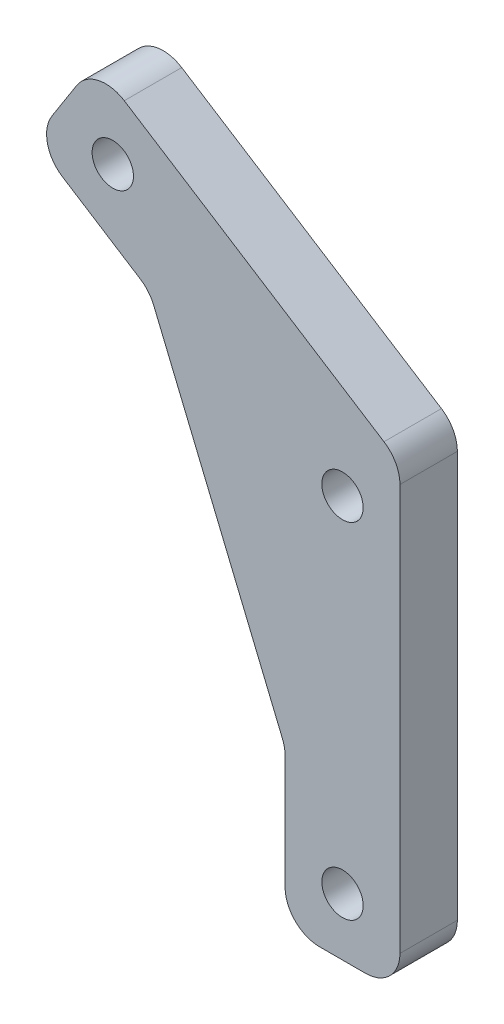
ISO-10303-21;
HEADER;
FILE_DESCRIPTION(('STEP AP214'),'2;1');
FILE_NAME('part.step','',(''),(''),'','','');
FILE_SCHEMA(('AUTOMOTIVE_DESIGN { 1 0 10303 214 1 1 1 1 }'));
ENDSEC;
DATA;
#1=APPLICATION_CONTEXT('core data for automotive mechanical design processes');
#2=APPLICATION_PROTOCOL_DEFINITION('international standard','automotive_design',2000,#1);
#3=PRODUCT_CONTEXT('',#1,'mechanical');
#4=PRODUCT('Part','Part','',(#3));
#5=PRODUCT_RELATED_PRODUCT_CATEGORY('part','',(#4));
#6=PRODUCT_DEFINITION_FORMATION('','',#4);
#7=PRODUCT_DEFINITION_CONTEXT('part definition',#1,'design');
#8=PRODUCT_DEFINITION('design','',#6,#7);
#9=PRODUCT_DEFINITION_SHAPE('','',#8);
#10=(LENGTH_UNIT() NAMED_UNIT(*) SI_UNIT(.MILLI.,.METRE.));
#11=(NAMED_UNIT(*) PLANE_ANGLE_UNIT() SI_UNIT($,.RADIAN.));
#12=(NAMED_UNIT(*) SI_UNIT($,.STERADIAN.) SOLID_ANGLE_UNIT());
#13=UNCERTAINTY_MEASURE_WITH_UNIT(LENGTH_MEASURE(1.E-05),#10,'distance_accuracy_value','');
#14=(GEOMETRIC_REPRESENTATION_CONTEXT(3) GLOBAL_UNCERTAINTY_ASSIGNED_CONTEXT((#13)) GLOBAL_UNIT_ASSIGNED_CONTEXT((#10,
#11,#12)) REPRESENTATION_CONTEXT('',''));
#15=CARTESIAN_POINT('',(0.,0.,0.));
#16=DIRECTION('',(0.,0.,1.));
#17=DIRECTION('',(1.,0.,0.));
#18=AXIS2_PLACEMENT_3D('',#15,#16,#17);
#19=CARTESIAN_POINT('',(0.,0.,6.35));
#20=DIRECTION('',(0.,0.,1.));
#21=DIRECTION('',(1.,0.,0.));
#22=AXIS2_PLACEMENT_3D('',#19,#20,#21);
#23=PLANE('',#22);
#24=CARTESIAN_POINT('',(0.,38.1,6.35));
#25=DIRECTION('',(0.,0.,1.));
#26=DIRECTION('',(1.,0.,0.));
#27=AXIS2_PLACEMENT_3D('',#24,#25,#26);
#28=CIRCLE('',#27,2.286);
#29=CARTESIAN_POINT('',(2.286,38.1,6.35));
#30=VERTEX_POINT('',#29);
#31=EDGE_CURVE('E508',#30,#30,#28,.T.);
#32=ORIENTED_EDGE('',*,*,#31,.F.);
#33=EDGE_LOOP('',(#32));
#34=FACE_BOUND('',#33,.T.);
#35=DIRECTION('',(-0.843362521056756,0.537345008422702,0.));
#36=VECTOR('',#35,1.);
#37=CARTESIAN_POINT('',(6.35,44.45,6.35));
#38=LINE('',#37,#36);
#39=CARTESIAN_POINT('',(4.58728448209049,45.5731070401742,6.35));
#40=VERTEX_POINT('',#39);
#41=CARTESIAN_POINT('',(-24.13,63.8702083301041,6.35));
#42=VERTEX_POINT('',#41);
#43=EDGE_CURVE('E182',#40,#42,#38,.T.);
#44=ORIENTED_EDGE('',*,*,#43,.T.);
#45=CARTESIAN_POINT('',(-26.1772844820905,60.6569971248778,6.35));
#46=DIRECTION('',(0.,0.,1.));
#47=DIRECTION('',(1.,0.,0.));
#48=AXIS2_PLACEMENT_3D('',#45,#46,#47);
#49=CIRCLE('',#48,3.81);
#50=CARTESIAN_POINT('',(-29.3904956873168,62.7042816069683,6.35));
#51=VERTEX_POINT('',#50);
#52=EDGE_CURVE('E217',#42,#51,#49,.T.);
#53=ORIENTED_EDGE('',*,*,#52,.T.);
#54=DIRECTION('',(-0.537345008422701,-0.843362521056756,0.));
#55=VECTOR('',#54,1.);
#56=CARTESIAN_POINT('',(-27.3432112052263,65.9174928121946,6.35));
#57=LINE('',#56,#55);
#58=CARTESIAN_POINT('',(-32.1202083301041,58.42,6.35));
#59=VERTEX_POINT('',#58);
#60=EDGE_CURVE('E165',#51,#59,#57,.T.);
#61=ORIENTED_EDGE('',*,*,#60,.T.);
#62=CARTESIAN_POINT('',(-28.9069971248778,56.3727155179095,6.35));
#63=DIRECTION('',(0.,0.,1.));
#64=DIRECTION('',(1.,0.,0.));
#65=AXIS2_PLACEMENT_3D('',#62,#63,#64);
#66=CIRCLE('',#65,3.81);
#67=CARTESIAN_POINT('',(-30.9542816069683,53.1595043126833,6.35));
#68=VERTEX_POINT('',#67);
#69=EDGE_CURVE('E210',#59,#68,#66,.T.);
#70=ORIENTED_EDGE('',*,*,#69,.T.);
#71=DIRECTION('',(0.843362521056756,-0.537345008422701,0.));
#72=VECTOR('',#71,1.);
#73=CARTESIAN_POINT('',(-34.1674928121946,55.2067887947738,6.35));
#74=LINE('',#73,#72);
#75=CARTESIAN_POINT('',(-22.3581072258093,47.6824866839427,6.35));
#76=VERTEX_POINT('',#75);
#77=EDGE_CURVE('E252',#68,#76,#74,.T.);
#78=ORIENTED_EDGE('',*,*,#77,.T.);
#79=CARTESIAN_POINT('',(-24.4053917078998,44.4692754787165,6.35));
#80=DIRECTION('',(0.,0.,1.));
#81=DIRECTION('',(1.,0.,0.));
#82=AXIS2_PLACEMENT_3D('',#79,#80,#81);
#83=CIRCLE('',#82,3.81);
#84=CARTESIAN_POINT('',(-20.8853322068173,45.9271098687756,6.35));
#85=VERTEX_POINT('',#84);
#86=EDGE_CURVE('E51',#76,#85,#83,.F.);
#87=ORIENTED_EDGE('',*,*,#86,.T.);
#88=DIRECTION('',(-0.382633698178239,0.923900131517711,0.));
#89=VECTOR('',#88,1.);
#90=CARTESIAN_POINT('',(-6.35,10.8303700848256,6.35));
#91=LINE('',#90,#89);
#92=CARTESIAN_POINT('',(-6.63994049891752,11.5304549606679,6.35));
#93=VERTEX_POINT('',#92);
#94=EDGE_CURVE('E197',#85,#93,#91,.F.);
#95=ORIENTED_EDGE('',*,*,#94,.T.);
#96=CARTESIAN_POINT('',(-10.16,10.0726205706088,6.35));
#97=DIRECTION('',(0.,0.,1.));
#98=DIRECTION('',(1.,0.,0.));
#99=AXIS2_PLACEMENT_3D('',#96,#97,#98);
#100=CIRCLE('',#99,3.81);
#101=CARTESIAN_POINT('',(-6.35,10.0726205706088,6.35));
#102=VERTEX_POINT('',#101);
#103=EDGE_CURVE('E245',#93,#102,#100,.F.);
#104=ORIENTED_EDGE('',*,*,#103,.T.);
#105=DIRECTION('',(0.,-1.,0.));
#106=VECTOR('',#105,1.);
#107=CARTESIAN_POINT('',(-6.35,37.4829861164933,6.35));
#108=LINE('',#107,#106);
#109=CARTESIAN_POINT('',(-6.35,-2.54,6.35));
#110=VERTEX_POINT('',#109);
#111=EDGE_CURVE('E268',#102,#110,#108,.T.);
#112=ORIENTED_EDGE('',*,*,#111,.T.);
#113=CARTESIAN_POINT('',(-2.54,-2.54,6.35));
#114=DIRECTION('',(0.,0.,1.));
#115=DIRECTION('',(1.,0.,0.));
#116=AXIS2_PLACEMENT_3D('',#113,#114,#115);
#117=CIRCLE('',#116,3.81);
#118=CARTESIAN_POINT('',(-2.54,-6.35,6.35));
#119=VERTEX_POINT('',#118);
#120=EDGE_CURVE('E212',#110,#119,#117,.T.);
#121=ORIENTED_EDGE('',*,*,#120,.T.);
#122=DIRECTION('',(1.,0.,0.));
#123=VECTOR('',#122,1.);
#124=CARTESIAN_POINT('',(-6.35,-6.35,6.35));
#125=LINE('',#124,#123);
#126=CARTESIAN_POINT('',(2.54,-6.35,6.35));
#127=VERTEX_POINT('',#126);
#128=EDGE_CURVE('E274',#119,#127,#125,.T.);
#129=ORIENTED_EDGE('',*,*,#128,.T.);
#130=CARTESIAN_POINT('',(2.54,-2.54,6.35));
#131=DIRECTION('',(0.,0.,1.));
#132=DIRECTION('',(1.,0.,0.));
#133=AXIS2_PLACEMENT_3D('',#130,#131,#132);
#134=CIRCLE('',#133,3.81);
#135=CARTESIAN_POINT('',(6.35,-2.54,6.35));
#136=VERTEX_POINT('',#135);
#137=EDGE_CURVE('E65',#127,#136,#134,.T.);
#138=ORIENTED_EDGE('',*,*,#137,.T.);
#139=DIRECTION('',(0.,1.,0.));
#140=VECTOR('',#139,1.);
#141=CARTESIAN_POINT('',(6.35,-6.35,6.35));
#142=LINE('',#141,#140);
#143=CARTESIAN_POINT('',(6.35,42.359895834948,6.35));
#144=VERTEX_POINT('',#143);
#145=EDGE_CURVE('E275',#136,#144,#142,.T.);
#146=ORIENTED_EDGE('',*,*,#145,.T.);
#147=CARTESIAN_POINT('',(2.54,42.359895834948,6.35));
#148=DIRECTION('',(0.,0.,1.));
#149=DIRECTION('',(1.,0.,0.));
#150=AXIS2_PLACEMENT_3D('',#147,#148,#149);
#151=CIRCLE('',#150,3.81);
#152=EDGE_CURVE('E215',#144,#40,#151,.T.);
#153=ORIENTED_EDGE('',*,*,#152,.T.);
#154=EDGE_LOOP('',(#44,#53,#61,#70,#78,#87,#95,#104,#112,#121,#129,#138,#146,#153));
#155=FACE_BOUND('',#154,.T.);
#156=CARTESIAN_POINT('',(0.,0.,6.35));
#157=DIRECTION('',(0.,0.,1.));
#158=DIRECTION('',(1.,0.,0.));
#159=AXIS2_PLACEMENT_3D('',#156,#157,#158);
#160=CIRCLE('',#159,2.286);
#161=CARTESIAN_POINT('',(2.286,0.,6.35));
#162=VERTEX_POINT('',#161);
#163=EDGE_CURVE('E173',#162,#162,#160,.T.);
#164=ORIENTED_EDGE('',*,*,#163,.F.);
#165=EDGE_LOOP('',(#164));
#166=FACE_BOUND('',#165,.T.);
#167=CARTESIAN_POINT('',(-25.4,57.15,6.35));
#168=DIRECTION('',(0.,0.,1.));
#169=DIRECTION('',(1.,0.,0.));
#170=AXIS2_PLACEMENT_3D('',#167,#168,#169);
#171=CIRCLE('',#170,2.286);
#172=CARTESIAN_POINT('',(-23.114,57.15,6.35));
#173=VERTEX_POINT('',#172);
#174=EDGE_CURVE('E513',#173,#173,#171,.T.);
#175=ORIENTED_EDGE('',*,*,#174,.F.);
#176=EDGE_LOOP('',(#175));
#177=FACE_BOUND('',#176,.T.);
#178=ADVANCED_FACE('F43',(#34,#155,#166,#177),#23,.T.);
#179=CARTESIAN_POINT('',(0.,0.,0.));
#180=DIRECTION('',(0.,0.,1.));
#181=DIRECTION('',(1.,0.,0.));
#182=AXIS2_PLACEMENT_3D('',#179,#180,#181);
#183=PLANE('',#182);
#184=DIRECTION('',(-0.537345008422701,-0.843362521056756,0.));
#185=VECTOR('',#184,1.);
#186=CARTESIAN_POINT('',(-27.3432112052263,65.9174928121946,0.));
#187=LINE('',#186,#185);
#188=CARTESIAN_POINT('',(-29.3904956873168,62.7042816069683,0.));
#189=VERTEX_POINT('',#188);
#190=CARTESIAN_POINT('',(-32.1202083301041,58.42,0.));
#191=VERTEX_POINT('',#190);
#192=EDGE_CURVE('E162',#189,#191,#187,.T.);
#193=ORIENTED_EDGE('',*,*,#192,.F.);
#194=CARTESIAN_POINT('',(-26.1772844820905,60.6569971248778,0.));
#195=DIRECTION('',(0.,0.,1.));
#196=DIRECTION('',(1.,0.,0.));
#197=AXIS2_PLACEMENT_3D('',#194,#195,#196);
#198=CIRCLE('',#197,3.81);
#199=CARTESIAN_POINT('',(-24.13,63.8702083301041,0.));
#200=VERTEX_POINT('',#199);
#201=EDGE_CURVE('E145',#189,#200,#198,.F.);
#202=ORIENTED_EDGE('',*,*,#201,.T.);
#203=DIRECTION('',(-0.843362521056756,0.537345008422702,0.));
#204=VECTOR('',#203,1.);
#205=CARTESIAN_POINT('',(6.35,44.45,0.));
#206=LINE('',#205,#204);
#207=CARTESIAN_POINT('',(4.58728448209049,45.5731070401742,0.));
#208=VERTEX_POINT('',#207);
#209=EDGE_CURVE('E192',#208,#200,#206,.T.);
#210=ORIENTED_EDGE('',*,*,#209,.F.);
#211=CARTESIAN_POINT('',(2.54,42.359895834948,0.));
#212=DIRECTION('',(0.,0.,1.));
#213=DIRECTION('',(1.,0.,0.));
#214=AXIS2_PLACEMENT_3D('',#211,#212,#213);
#215=CIRCLE('',#214,3.81);
#216=CARTESIAN_POINT('',(6.35,42.359895834948,0.));
#217=VERTEX_POINT('',#216);
#218=EDGE_CURVE('E156',#208,#217,#215,.F.);
#219=ORIENTED_EDGE('',*,*,#218,.T.);
#220=DIRECTION('',(0.,1.,0.));
#221=VECTOR('',#220,1.);
#222=CARTESIAN_POINT('',(6.35,-6.35,0.));
#223=LINE('',#222,#221);
#224=CARTESIAN_POINT('',(6.35,-2.54,0.));
#225=VERTEX_POINT('',#224);
#226=EDGE_CURVE('E190',#225,#217,#223,.T.);
#227=ORIENTED_EDGE('',*,*,#226,.F.);
#228=CARTESIAN_POINT('',(2.54,-2.54,0.));
#229=DIRECTION('',(0.,0.,1.));
#230=DIRECTION('',(1.,0.,0.));
#231=AXIS2_PLACEMENT_3D('',#228,#229,#230);
#232=CIRCLE('',#231,3.81);
#233=CARTESIAN_POINT('',(2.54,-6.35,0.));
#234=VERTEX_POINT('',#233);
#235=EDGE_CURVE('E204',#225,#234,#232,.F.);
#236=ORIENTED_EDGE('',*,*,#235,.T.);
#237=DIRECTION('',(1.,0.,0.));
#238=VECTOR('',#237,1.);
#239=CARTESIAN_POINT('',(-6.35,-6.35,0.));
#240=LINE('',#239,#238);
#241=CARTESIAN_POINT('',(-2.54,-6.35,0.));
#242=VERTEX_POINT('',#241);
#243=EDGE_CURVE('E187',#242,#234,#240,.T.);
#244=ORIENTED_EDGE('',*,*,#243,.F.);
#245=CARTESIAN_POINT('',(-2.54,-2.54,0.));
#246=DIRECTION('',(0.,0.,1.));
#247=DIRECTION('',(1.,0.,0.));
#248=AXIS2_PLACEMENT_3D('',#245,#246,#247);
#249=CIRCLE('',#248,3.81);
#250=CARTESIAN_POINT('',(-6.35,-2.54,0.));
#251=VERTEX_POINT('',#250);
#252=EDGE_CURVE('E202',#242,#251,#249,.F.);
#253=ORIENTED_EDGE('',*,*,#252,.T.);
#254=DIRECTION('',(0.,-1.,0.));
#255=VECTOR('',#254,1.);
#256=CARTESIAN_POINT('',(-6.35,37.4829861164933,0.));
#257=LINE('',#256,#255);
#258=CARTESIAN_POINT('',(-6.35,10.0726205706088,0.));
#259=VERTEX_POINT('',#258);
#260=EDGE_CURVE('E176',#259,#251,#257,.T.);
#261=ORIENTED_EDGE('',*,*,#260,.F.);
#262=CARTESIAN_POINT('',(-10.16,10.0726205706088,0.));
#263=DIRECTION('',(0.,0.,1.));
#264=DIRECTION('',(1.,0.,0.));
#265=AXIS2_PLACEMENT_3D('',#262,#263,#264);
#266=CIRCLE('',#265,3.81);
#267=CARTESIAN_POINT('',(-6.63994049891752,11.5304549606679,0.));
#268=VERTEX_POINT('',#267);
#269=EDGE_CURVE('E243',#259,#268,#266,.T.);
#270=ORIENTED_EDGE('',*,*,#269,.T.);
#271=DIRECTION('',(0.382633698178239,-0.923900131517711,0.));
#272=VECTOR('',#271,1.);
#273=CARTESIAN_POINT('',(-1.59160393633215,-0.659163560452572,0.));
#274=LINE('',#273,#272);
#275=CARTESIAN_POINT('',(-20.8853322068173,45.9271098687756,0.));
#276=VERTEX_POINT('',#275);
#277=EDGE_CURVE('E194',#268,#276,#274,.F.);
#278=ORIENTED_EDGE('',*,*,#277,.T.);
#279=CARTESIAN_POINT('',(-24.4053917078998,44.4692754787165,0.));
#280=DIRECTION('',(0.,0.,1.));
#281=DIRECTION('',(1.,0.,0.));
#282=AXIS2_PLACEMENT_3D('',#279,#280,#281);
#283=CIRCLE('',#282,3.81);
#284=CARTESIAN_POINT('',(-22.3581072258093,47.6824866839427,0.));
#285=VERTEX_POINT('',#284);
#286=EDGE_CURVE('E11',#276,#285,#283,.T.);
#287=ORIENTED_EDGE('',*,*,#286,.T.);
#288=DIRECTION('',(0.843362521056756,-0.537345008422701,0.));
#289=VECTOR('',#288,1.);
#290=CARTESIAN_POINT('',(-34.1674928121946,55.2067887947738,0.));
#291=LINE('',#290,#289);
#292=CARTESIAN_POINT('',(-30.9542816069683,53.1595043126833,0.));
#293=VERTEX_POINT('',#292);
#294=EDGE_CURVE('E172',#293,#285,#291,.T.);
#295=ORIENTED_EDGE('',*,*,#294,.F.);
#296=CARTESIAN_POINT('',(-28.9069971248778,56.3727155179095,0.));
#297=DIRECTION('',(0.,0.,1.));
#298=DIRECTION('',(1.,0.,0.));
#299=AXIS2_PLACEMENT_3D('',#296,#297,#298);
#300=CIRCLE('',#299,3.81);
#301=EDGE_CURVE('E166',#293,#191,#300,.F.);
#302=ORIENTED_EDGE('',*,*,#301,.T.);
#303=EDGE_LOOP('',(#193,#202,#210,#219,#227,#236,#244,#253,#261,#270,#278,#287,#295,#302));
#304=FACE_BOUND('',#303,.T.);
#305=CARTESIAN_POINT('',(0.,0.,0.));
#306=DIRECTION('',(0.,0.,1.));
#307=DIRECTION('',(1.,0.,0.));
#308=AXIS2_PLACEMENT_3D('',#305,#306,#307);
#309=CIRCLE('',#308,2.286);
#310=CARTESIAN_POINT('',(2.286,0.,0.));
#311=VERTEX_POINT('',#310);
#312=EDGE_CURVE('E179',#311,#311,#309,.T.);
#313=ORIENTED_EDGE('',*,*,#312,.T.);
#314=EDGE_LOOP('',(#313));
#315=FACE_BOUND('',#314,.T.);
#316=CARTESIAN_POINT('',(0.,38.1,0.));
#317=DIRECTION('',(0.,0.,1.));
#318=DIRECTION('',(1.,0.,0.));
#319=AXIS2_PLACEMENT_3D('',#316,#317,#318);
#320=CIRCLE('',#319,2.286);
#321=CARTESIAN_POINT('',(2.286,38.1,0.));
#322=VERTEX_POINT('',#321);
#323=EDGE_CURVE('E510',#322,#322,#320,.T.);
#324=ORIENTED_EDGE('',*,*,#323,.T.);
#325=EDGE_LOOP('',(#324));
#326=FACE_BOUND('',#325,.T.);
#327=CARTESIAN_POINT('',(-25.4,57.15,0.));
#328=DIRECTION('',(0.,0.,1.));
#329=DIRECTION('',(1.,0.,0.));
#330=AXIS2_PLACEMENT_3D('',#327,#328,#329);
#331=CIRCLE('',#330,2.286);
#332=CARTESIAN_POINT('',(-23.114,57.15,0.));
#333=VERTEX_POINT('',#332);
#334=EDGE_CURVE('E516',#333,#333,#331,.T.);
#335=ORIENTED_EDGE('',*,*,#334,.T.);
#336=EDGE_LOOP('',(#335));
#337=FACE_BOUND('',#336,.T.);
#338=ADVANCED_FACE('F169',(#304,#315,#326,#337),#183,.F.);
#339=CARTESIAN_POINT('',(-27.3432112052263,65.9174928121946,6.35));
#340=DIRECTION('',(0.843362521056756,-0.537345008422701,0.));
#341=DIRECTION('',(0.537345008422701,0.843362521056756,0.));
#342=AXIS2_PLACEMENT_3D('',#339,#340,#341);
#343=PLANE('',#342);
#344=ORIENTED_EDGE('',*,*,#60,.F.);
#345=DIRECTION('',(0.,0.,-1.));
#346=VECTOR('',#345,1.);
#347=CARTESIAN_POINT('',(-29.3904956873168,62.7042816069683,6.35));
#348=LINE('',#347,#346);
#349=EDGE_CURVE('E149',#51,#189,#348,.T.);
#350=ORIENTED_EDGE('',*,*,#349,.T.);
#351=ORIENTED_EDGE('',*,*,#192,.T.);
#352=DIRECTION('',(0.,0.,-1.));
#353=VECTOR('',#352,1.);
#354=CARTESIAN_POINT('',(-32.1202083301041,58.42,6.35));
#355=LINE('',#354,#353);
#356=EDGE_CURVE('E167',#191,#59,#355,.F.);
#357=ORIENTED_EDGE('',*,*,#356,.T.);
#358=EDGE_LOOP('',(#344,#350,#351,#357));
#359=FACE_BOUND('',#358,.T.);
#360=ADVANCED_FACE('F161',(#359),#343,.F.);
#361=CARTESIAN_POINT('',(-34.1674928121946,55.2067887947738,6.35));
#362=DIRECTION('',(0.537345008422701,0.843362521056756,0.));
#363=DIRECTION('',(-0.843362521056756,0.537345008422701,0.));
#364=AXIS2_PLACEMENT_3D('',#361,#362,#363);
#365=PLANE('',#364);
#366=ORIENTED_EDGE('',*,*,#294,.T.);
#367=DIRECTION('',(0.,0.,-1.));
#368=VECTOR('',#367,1.);
#369=CARTESIAN_POINT('',(-22.3581072258093,47.6824866839427,6.35));
#370=LINE('',#369,#368);
#371=EDGE_CURVE('E240',#285,#76,#370,.F.);
#372=ORIENTED_EDGE('',*,*,#371,.T.);
#373=ORIENTED_EDGE('',*,*,#77,.F.);
#374=DIRECTION('',(0.,0.,-1.));
#375=VECTOR('',#374,1.);
#376=CARTESIAN_POINT('',(-30.9542816069683,53.1595043126833,6.35));
#377=LINE('',#376,#375);
#378=EDGE_CURVE('E237',#68,#293,#377,.T.);
#379=ORIENTED_EDGE('',*,*,#378,.T.);
#380=EDGE_LOOP('',(#366,#372,#373,#379));
#381=FACE_BOUND('',#380,.T.);
#382=ADVANCED_FACE('F263',(#381),#365,.F.);
#383=CARTESIAN_POINT('',(-6.35,37.4829861164933,6.35));
#384=DIRECTION('',(1.,0.,0.));
#385=DIRECTION('',(0.,1.,0.));
#386=AXIS2_PLACEMENT_3D('',#383,#384,#385);
#387=PLANE('',#386);
#388=ORIENTED_EDGE('',*,*,#260,.T.);
#389=DIRECTION('',(0.,0.,-1.));
#390=VECTOR('',#389,1.);
#391=CARTESIAN_POINT('',(-6.35,-2.54,6.35));
#392=LINE('',#391,#390);
#393=EDGE_CURVE('E231',#251,#110,#392,.F.);
#394=ORIENTED_EDGE('',*,*,#393,.T.);
#395=ORIENTED_EDGE('',*,*,#111,.F.);
#396=DIRECTION('',(0.,0.,1.));
#397=VECTOR('',#396,1.);
#398=CARTESIAN_POINT('',(-6.35,10.0726205706088,0.));
#399=LINE('',#398,#397);
#400=EDGE_CURVE('E228',#102,#259,#399,.F.);
#401=ORIENTED_EDGE('',*,*,#400,.T.);
#402=EDGE_LOOP('',(#388,#394,#395,#401));
#403=FACE_BOUND('',#402,.T.);
#404=ADVANCED_FACE('F300',(#403),#387,.F.);
#405=CARTESIAN_POINT('',(-6.35,-6.35,6.35));
#406=DIRECTION('',(0.,1.,0.));
#407=DIRECTION('',(0.,0.,1.));
#408=AXIS2_PLACEMENT_3D('',#405,#406,#407);
#409=PLANE('',#408);
#410=ORIENTED_EDGE('',*,*,#243,.T.);
#411=DIRECTION('',(0.,0.,-1.));
#412=VECTOR('',#411,1.);
#413=CARTESIAN_POINT('',(2.54,-6.35,6.35));
#414=LINE('',#413,#412);
#415=EDGE_CURVE('E226',#234,#127,#414,.F.);
#416=ORIENTED_EDGE('',*,*,#415,.T.);
#417=ORIENTED_EDGE('',*,*,#128,.F.);
#418=DIRECTION('',(0.,0.,-1.));
#419=VECTOR('',#418,1.);
#420=CARTESIAN_POINT('',(-2.54,-6.35,6.35));
#421=LINE('',#420,#419);
#422=EDGE_CURVE('E223',#119,#242,#421,.T.);
#423=ORIENTED_EDGE('',*,*,#422,.T.);
#424=EDGE_LOOP('',(#410,#416,#417,#423));
#425=FACE_BOUND('',#424,.T.);
#426=ADVANCED_FACE('F291',(#425),#409,.F.);
#427=CARTESIAN_POINT('',(6.35,-6.35,6.35));
#428=DIRECTION('',(-1.,0.,0.));
#429=DIRECTION('',(0.,-1.,0.));
#430=AXIS2_PLACEMENT_3D('',#427,#428,#429);
#431=PLANE('',#430);
#432=ORIENTED_EDGE('',*,*,#226,.T.);
#433=DIRECTION('',(0.,0.,-1.));
#434=VECTOR('',#433,1.);
#435=CARTESIAN_POINT('',(6.35,42.359895834948,6.35));
#436=LINE('',#435,#434);
#437=EDGE_CURVE('E58',#217,#144,#436,.F.);
#438=ORIENTED_EDGE('',*,*,#437,.T.);
#439=ORIENTED_EDGE('',*,*,#145,.F.);
#440=DIRECTION('',(0.,0.,-1.));
#441=VECTOR('',#440,1.);
#442=CARTESIAN_POINT('',(6.35,-2.54,6.35));
#443=LINE('',#442,#441);
#444=EDGE_CURVE('E219',#136,#225,#443,.T.);
#445=ORIENTED_EDGE('',*,*,#444,.T.);
#446=EDGE_LOOP('',(#432,#438,#439,#445));
#447=FACE_BOUND('',#446,.T.);
#448=ADVANCED_FACE('F284',(#447),#431,.F.);
#449=CARTESIAN_POINT('',(6.35,44.45,6.35));
#450=DIRECTION('',(-0.537345008422702,-0.843362521056756,0.));
#451=DIRECTION('',(0.843362521056756,-0.537345008422702,0.));
#452=AXIS2_PLACEMENT_3D('',#449,#450,#451);
#453=PLANE('',#452);
#454=ORIENTED_EDGE('',*,*,#209,.T.);
#455=DIRECTION('',(0.,0.,-1.));
#456=VECTOR('',#455,1.);
#457=CARTESIAN_POINT('',(-24.13,63.8702083301041,6.35));
#458=LINE('',#457,#456);
#459=EDGE_CURVE('E150',#200,#42,#458,.F.);
#460=ORIENTED_EDGE('',*,*,#459,.T.);
#461=ORIENTED_EDGE('',*,*,#43,.F.);
#462=DIRECTION('',(0.,0.,-1.));
#463=VECTOR('',#462,1.);
#464=CARTESIAN_POINT('',(4.58728448209049,45.5731070401742,6.35));
#465=LINE('',#464,#463);
#466=EDGE_CURVE('E155',#40,#208,#465,.T.);
#467=ORIENTED_EDGE('',*,*,#466,.T.);
#468=EDGE_LOOP('',(#454,#460,#461,#467));
#469=FACE_BOUND('',#468,.T.);
#470=ADVANCED_FACE('F280',(#469),#453,.F.);
#471=CARTESIAN_POINT('',(0.,0.,6.35));
#472=DIRECTION('',(0.,0.,-1.));
#473=DIRECTION('',(-1.,0.,0.));
#474=AXIS2_PLACEMENT_3D('',#471,#472,#473);
#475=CYLINDRICAL_SURFACE('',#474,2.286);
#476=ORIENTED_EDGE('',*,*,#163,.T.);
#477=EDGE_LOOP('',(#476));
#478=FACE_BOUND('',#477,.T.);
#479=ORIENTED_EDGE('',*,*,#312,.F.);
#480=EDGE_LOOP('',(#479));
#481=FACE_BOUND('',#480,.T.);
#482=ADVANCED_FACE('F322',(#478,#481),#475,.F.);
#483=CARTESIAN_POINT('',(0.,38.1,6.35));
#484=DIRECTION('',(0.,0.,-1.));
#485=DIRECTION('',(-1.,0.,0.));
#486=AXIS2_PLACEMENT_3D('',#483,#484,#485);
#487=CYLINDRICAL_SURFACE('',#486,2.286);
#488=ORIENTED_EDGE('',*,*,#31,.T.);
#489=EDGE_LOOP('',(#488));
#490=FACE_BOUND('',#489,.T.);
#491=ORIENTED_EDGE('',*,*,#323,.F.);
#492=EDGE_LOOP('',(#491));
#493=FACE_BOUND('',#492,.T.);
#494=ADVANCED_FACE('F411',(#490,#493),#487,.F.);
#495=CARTESIAN_POINT('',(-25.4,57.15,6.35));
#496=DIRECTION('',(0.,0.,-1.));
#497=DIRECTION('',(-1.,0.,0.));
#498=AXIS2_PLACEMENT_3D('',#495,#496,#497);
#499=CYLINDRICAL_SURFACE('',#498,2.286);
#500=ORIENTED_EDGE('',*,*,#174,.T.);
#501=EDGE_LOOP('',(#500));
#502=FACE_BOUND('',#501,.T.);
#503=ORIENTED_EDGE('',*,*,#334,.F.);
#504=EDGE_LOOP('',(#503));
#505=FACE_BOUND('',#504,.T.);
#506=ADVANCED_FACE('F342',(#502,#505),#499,.F.);
#507=CARTESIAN_POINT('',(-6.35,10.8303700848256,6.35));
#508=DIRECTION('',(-0.923900131517711,-0.382633698178239,0.));
#509=DIRECTION('',(0.,0.,1.));
#510=AXIS2_PLACEMENT_3D('',#507,#508,#509);
#511=PLANE('',#510);
#512=ORIENTED_EDGE('',*,*,#277,.F.);
#513=DIRECTION('',(0.,0.,-1.));
#514=VECTOR('',#513,1.);
#515=CARTESIAN_POINT('',(-6.63994049891752,11.5304549606679,6.35));
#516=LINE('',#515,#514);
#517=EDGE_CURVE('E235',#268,#93,#516,.F.);
#518=ORIENTED_EDGE('',*,*,#517,.T.);
#519=ORIENTED_EDGE('',*,*,#94,.F.);
#520=DIRECTION('',(0.,0.,1.));
#521=VECTOR('',#520,1.);
#522=CARTESIAN_POINT('',(-20.8853322068173,45.9271098687756,0.));
#523=LINE('',#522,#521);
#524=EDGE_CURVE('E233',#85,#276,#523,.F.);
#525=ORIENTED_EDGE('',*,*,#524,.T.);
#526=EDGE_LOOP('',(#512,#518,#519,#525));
#527=FACE_BOUND('',#526,.T.);
#528=ADVANCED_FACE('F258',(#527),#511,.T.);
#529=CARTESIAN_POINT('',(-26.1772844820905,60.6569971248778,6.35));
#530=DIRECTION('',(0.,0.,-1.));
#531=DIRECTION('',(-1.,0.,0.));
#532=AXIS2_PLACEMENT_3D('',#529,#530,#531);
#533=CYLINDRICAL_SURFACE('',#532,3.81);
#534=ORIENTED_EDGE('',*,*,#52,.F.);
#535=ORIENTED_EDGE('',*,*,#459,.F.);
#536=ORIENTED_EDGE('',*,*,#201,.F.);
#537=ORIENTED_EDGE('',*,*,#349,.F.);
#538=EDGE_LOOP('',(#534,#535,#536,#537));
#539=FACE_BOUND('',#538,.T.);
#540=ADVANCED_FACE('F148',(#539),#533,.T.);
#541=CARTESIAN_POINT('',(2.54,42.359895834948,6.35));
#542=DIRECTION('',(0.,0.,-1.));
#543=DIRECTION('',(-1.,0.,0.));
#544=AXIS2_PLACEMENT_3D('',#541,#542,#543);
#545=CYLINDRICAL_SURFACE('',#544,3.81);
#546=ORIENTED_EDGE('',*,*,#152,.F.);
#547=ORIENTED_EDGE('',*,*,#437,.F.);
#548=ORIENTED_EDGE('',*,*,#218,.F.);
#549=ORIENTED_EDGE('',*,*,#466,.F.);
#550=EDGE_LOOP('',(#546,#547,#548,#549));
#551=FACE_BOUND('',#550,.T.);
#552=ADVANCED_FACE('F282',(#551),#545,.T.);
#553=CARTESIAN_POINT('',(2.54,-2.54,6.35));
#554=DIRECTION('',(0.,0.,-1.));
#555=DIRECTION('',(-1.,0.,0.));
#556=AXIS2_PLACEMENT_3D('',#553,#554,#555);
#557=CYLINDRICAL_SURFACE('',#556,3.81);
#558=ORIENTED_EDGE('',*,*,#137,.F.);
#559=ORIENTED_EDGE('',*,*,#415,.F.);
#560=ORIENTED_EDGE('',*,*,#235,.F.);
#561=ORIENTED_EDGE('',*,*,#444,.F.);
#562=EDGE_LOOP('',(#558,#559,#560,#561));
#563=FACE_BOUND('',#562,.T.);
#564=ADVANCED_FACE('F287',(#563),#557,.T.);
#565=CARTESIAN_POINT('',(-2.54,-2.54,6.35));
#566=DIRECTION('',(0.,0.,-1.));
#567=DIRECTION('',(-1.,0.,0.));
#568=AXIS2_PLACEMENT_3D('',#565,#566,#567);
#569=CYLINDRICAL_SURFACE('',#568,3.81);
#570=ORIENTED_EDGE('',*,*,#120,.F.);
#571=ORIENTED_EDGE('',*,*,#393,.F.);
#572=ORIENTED_EDGE('',*,*,#252,.F.);
#573=ORIENTED_EDGE('',*,*,#422,.F.);
#574=EDGE_LOOP('',(#570,#571,#572,#573));
#575=FACE_BOUND('',#574,.T.);
#576=ADVANCED_FACE('F296',(#575),#569,.T.);
#577=CARTESIAN_POINT('',(-10.16,10.0726205706088,6.35));
#578=DIRECTION('',(0.,0.,-1.));
#579=DIRECTION('',(-1.,0.,0.));
#580=AXIS2_PLACEMENT_3D('',#577,#578,#579);
#581=CYLINDRICAL_SURFACE('',#580,3.81);
#582=ORIENTED_EDGE('',*,*,#103,.F.);
#583=ORIENTED_EDGE('',*,*,#517,.F.);
#584=ORIENTED_EDGE('',*,*,#269,.F.);
#585=ORIENTED_EDGE('',*,*,#400,.F.);
#586=EDGE_LOOP('',(#582,#583,#584,#585));
#587=FACE_BOUND('',#586,.T.);
#588=ADVANCED_FACE('F304',(#587),#581,.F.);
#589=CARTESIAN_POINT('',(-24.4053917078998,44.4692754787165,6.35));
#590=DIRECTION('',(0.,0.,1.));
#591=DIRECTION('',(1.,0.,0.));
#592=AXIS2_PLACEMENT_3D('',#589,#590,#591);
#593=CYLINDRICAL_SURFACE('',#592,3.81);
#594=ORIENTED_EDGE('',*,*,#286,.F.);
#595=ORIENTED_EDGE('',*,*,#524,.F.);
#596=ORIENTED_EDGE('',*,*,#86,.F.);
#597=ORIENTED_EDGE('',*,*,#371,.F.);
#598=EDGE_LOOP('',(#594,#595,#596,#597));
#599=FACE_BOUND('',#598,.T.);
#600=ADVANCED_FACE('F261',(#599),#593,.F.);
#601=CARTESIAN_POINT('',(-28.9069971248778,56.3727155179095,6.35));
#602=DIRECTION('',(0.,0.,-1.));
#603=DIRECTION('',(-1.,0.,0.));
#604=AXIS2_PLACEMENT_3D('',#601,#602,#603);
#605=CYLINDRICAL_SURFACE('',#604,3.81);
#606=ORIENTED_EDGE('',*,*,#69,.F.);
#607=ORIENTED_EDGE('',*,*,#356,.F.);
#608=ORIENTED_EDGE('',*,*,#301,.F.);
#609=ORIENTED_EDGE('',*,*,#378,.F.);
#610=EDGE_LOOP('',(#606,#607,#608,#609));
#611=FACE_BOUND('',#610,.T.);
#612=ADVANCED_FACE('F45',(#611),#605,.T.);
#613=CLOSED_SHELL('',(#178,#338,#360,#382,#404,#426,#448,#470,#482,#494,#506,#528,#540,#552,
#564,#576,#588,#600,#612));
#614=MANIFOLD_SOLID_BREP('B2',#613);
#615=ADVANCED_BREP_SHAPE_REPRESENTATION('',(#18,#614),#14);
#616=SHAPE_DEFINITION_REPRESENTATION(#9,#615);
ENDSEC;
END-ISO-10303-21;
